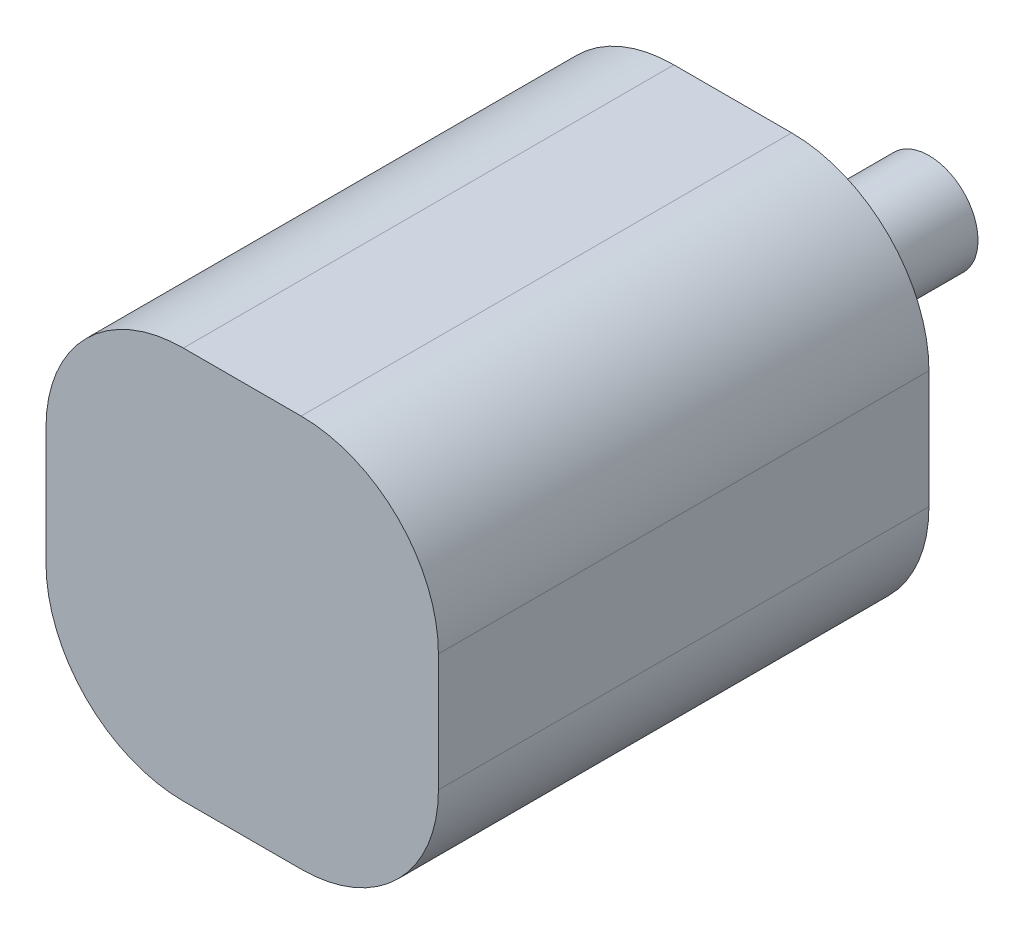
ISO-10303-21;
HEADER;
FILE_DESCRIPTION(('STEP AP214'),'2;1');
FILE_NAME('part.step','',(''),(''),'','','');
FILE_SCHEMA(('AUTOMOTIVE_DESIGN { 1 0 10303 214 1 1 1 1 }'));
ENDSEC;
DATA;
#1=APPLICATION_CONTEXT('core data for automotive mechanical design processes');
#2=APPLICATION_PROTOCOL_DEFINITION('international standard','automotive_design',2000,#1);
#3=PRODUCT_CONTEXT('',#1,'mechanical');
#4=PRODUCT('Part','Part','',(#3));
#5=PRODUCT_RELATED_PRODUCT_CATEGORY('part','',(#4));
#6=PRODUCT_DEFINITION_FORMATION('','',#4);
#7=PRODUCT_DEFINITION_CONTEXT('part definition',#1,'design');
#8=PRODUCT_DEFINITION('design','',#6,#7);
#9=PRODUCT_DEFINITION_SHAPE('','',#8);
#10=(LENGTH_UNIT() NAMED_UNIT(*) SI_UNIT(.MILLI.,.METRE.));
#11=(NAMED_UNIT(*) PLANE_ANGLE_UNIT() SI_UNIT($,.RADIAN.));
#12=(NAMED_UNIT(*) SI_UNIT($,.STERADIAN.) SOLID_ANGLE_UNIT());
#13=UNCERTAINTY_MEASURE_WITH_UNIT(LENGTH_MEASURE(1.E-05),#10,'distance_accuracy_value','');
#14=(GEOMETRIC_REPRESENTATION_CONTEXT(3) GLOBAL_UNCERTAINTY_ASSIGNED_CONTEXT((#13)) GLOBAL_UNIT_ASSIGNED_CONTEXT((#10,
#11,#12)) REPRESENTATION_CONTEXT('',''));
#15=CARTESIAN_POINT('',(0.,0.,0.));
#16=DIRECTION('',(0.,0.,1.));
#17=DIRECTION('',(1.,0.,0.));
#18=AXIS2_PLACEMENT_3D('',#15,#16,#17);
#19=CARTESIAN_POINT('',(0.,0.,10.));
#20=DIRECTION('',(0.,0.,-1.));
#21=DIRECTION('',(-1.,0.,0.));
#22=AXIS2_PLACEMENT_3D('',#19,#20,#21);
#23=CYLINDRICAL_SURFACE('',#22,2.5);
#24=CARTESIAN_POINT('',(0.,0.,10.));
#25=DIRECTION('',(0.,0.,1.));
#26=DIRECTION('',(1.,0.,0.));
#27=AXIS2_PLACEMENT_3D('',#24,#25,#26);
#28=CIRCLE('',#27,2.5);
#29=CARTESIAN_POINT('',(2.5,0.,10.));
#30=VERTEX_POINT('',#29);
#31=EDGE_CURVE('E140',#30,#30,#28,.T.);
#32=ORIENTED_EDGE('',*,*,#31,.F.);
#33=EDGE_LOOP('',(#32));
#34=FACE_BOUND('',#33,.T.);
#35=CARTESIAN_POINT('',(0.,0.,0.));
#36=DIRECTION('',(0.,0.,1.));
#37=DIRECTION('',(1.,0.,0.));
#38=AXIS2_PLACEMENT_3D('',#35,#36,#37);
#39=CIRCLE('',#38,2.5);
#40=CARTESIAN_POINT('',(2.5,0.,0.));
#41=VERTEX_POINT('',#40);
#42=EDGE_CURVE('E143',#41,#41,#39,.T.);
#43=ORIENTED_EDGE('',*,*,#42,.T.);
#44=EDGE_LOOP('',(#43));
#45=FACE_BOUND('',#44,.T.);
#46=ADVANCED_FACE('F37',(#34,#45),#23,.T.);
#47=CARTESIAN_POINT('',(0.,0.,0.));
#48=DIRECTION('',(0.,0.,1.));
#49=DIRECTION('',(1.,0.,0.));
#50=AXIS2_PLACEMENT_3D('',#47,#48,#49);
#51=PLANE('',#50);
#52=ORIENTED_EDGE('',*,*,#42,.F.);
#53=EDGE_LOOP('',(#52));
#54=FACE_BOUND('',#53,.T.);
#55=ADVANCED_FACE('F198',(#54),#51,.F.);
#56=CARTESIAN_POINT('',(10.,10.,35.));
#57=DIRECTION('',(-1.,0.,0.));
#58=DIRECTION('',(0.,-1.,0.));
#59=AXIS2_PLACEMENT_3D('',#56,#57,#58);
#60=PLANE('',#59);
#61=DIRECTION('',(0.,1.,0.));
#62=VECTOR('',#61,1.);
#63=CARTESIAN_POINT('',(10.,10.,35.));
#64=LINE('',#63,#62);
#65=CARTESIAN_POINT('',(10.,-3.,35.));
#66=VERTEX_POINT('',#65);
#67=CARTESIAN_POINT('',(10.,3.,35.));
#68=VERTEX_POINT('',#67);
#69=EDGE_CURVE('E131',#66,#68,#64,.T.);
#70=ORIENTED_EDGE('',*,*,#69,.F.);
#71=DIRECTION('',(0.,0.,-1.));
#72=VECTOR('',#71,1.);
#73=CARTESIAN_POINT('',(10.,-3.,35.));
#74=LINE('',#73,#72);
#75=CARTESIAN_POINT('',(10.,-3.,10.));
#76=VERTEX_POINT('',#75);
#77=EDGE_CURVE('E11',#66,#76,#74,.T.);
#78=ORIENTED_EDGE('',*,*,#77,.T.);
#79=DIRECTION('',(0.,1.,0.));
#80=VECTOR('',#79,1.);
#81=CARTESIAN_POINT('',(10.,10.,10.));
#82=LINE('',#81,#80);
#83=CARTESIAN_POINT('',(10.,3.,10.));
#84=VERTEX_POINT('',#83);
#85=EDGE_CURVE('E169',#76,#84,#82,.T.);
#86=ORIENTED_EDGE('',*,*,#85,.T.);
#87=DIRECTION('',(0.,0.,-1.));
#88=VECTOR('',#87,1.);
#89=CARTESIAN_POINT('',(10.,3.,35.));
#90=LINE('',#89,#88);
#91=EDGE_CURVE('E45',#84,#68,#90,.F.);
#92=ORIENTED_EDGE('',*,*,#91,.T.);
#93=EDGE_LOOP('',(#70,#78,#86,#92));
#94=FACE_BOUND('',#93,.T.);
#95=ADVANCED_FACE('F167',(#94),#60,.F.);
#96=CARTESIAN_POINT('',(-10.,10.,35.));
#97=DIRECTION('',(0.,-1.,0.));
#98=DIRECTION('',(0.,0.,-1.));
#99=AXIS2_PLACEMENT_3D('',#96,#97,#98);
#100=PLANE('',#99);
#101=DIRECTION('',(-1.,0.,0.));
#102=VECTOR('',#101,1.);
#103=CARTESIAN_POINT('',(-10.,10.,10.));
#104=LINE('',#103,#102);
#105=CARTESIAN_POINT('',(3.,10.,10.));
#106=VERTEX_POINT('',#105);
#107=CARTESIAN_POINT('',(-3.,10.,10.));
#108=VERTEX_POINT('',#107);
#109=EDGE_CURVE('E136',#106,#108,#104,.T.);
#110=ORIENTED_EDGE('',*,*,#109,.T.);
#111=DIRECTION('',(0.,0.,-1.));
#112=VECTOR('',#111,1.);
#113=CARTESIAN_POINT('',(-3.,10.,35.));
#114=LINE('',#113,#112);
#115=CARTESIAN_POINT('',(-3.,10.,35.));
#116=VERTEX_POINT('',#115);
#117=EDGE_CURVE('E52',#108,#116,#114,.F.);
#118=ORIENTED_EDGE('',*,*,#117,.T.);
#119=DIRECTION('',(-1.,0.,0.));
#120=VECTOR('',#119,1.);
#121=CARTESIAN_POINT('',(-10.,10.,35.));
#122=LINE('',#121,#120);
#123=CARTESIAN_POINT('',(3.,10.,35.));
#124=VERTEX_POINT('',#123);
#125=EDGE_CURVE('E134',#124,#116,#122,.T.);
#126=ORIENTED_EDGE('',*,*,#125,.F.);
#127=DIRECTION('',(0.,0.,-1.));
#128=VECTOR('',#127,1.);
#129=CARTESIAN_POINT('',(3.,10.,35.));
#130=LINE('',#129,#128);
#131=EDGE_CURVE('E160',#124,#106,#130,.T.);
#132=ORIENTED_EDGE('',*,*,#131,.T.);
#133=EDGE_LOOP('',(#110,#118,#126,#132));
#134=FACE_BOUND('',#133,.T.);
#135=ADVANCED_FACE('F176',(#134),#100,.F.);
#136=CARTESIAN_POINT('',(-10.,10.,35.));
#137=DIRECTION('',(1.,0.,0.));
#138=DIRECTION('',(0.,1.,0.));
#139=AXIS2_PLACEMENT_3D('',#136,#137,#138);
#140=PLANE('',#139);
#141=DIRECTION('',(0.,-1.,0.));
#142=VECTOR('',#141,1.);
#143=CARTESIAN_POINT('',(-10.,10.,10.));
#144=LINE('',#143,#142);
#145=CARTESIAN_POINT('',(-10.,3.,10.));
#146=VERTEX_POINT('',#145);
#147=CARTESIAN_POINT('',(-10.,-3.,10.));
#148=VERTEX_POINT('',#147);
#149=EDGE_CURVE('E132',#146,#148,#144,.T.);
#150=ORIENTED_EDGE('',*,*,#149,.T.);
#151=DIRECTION('',(0.,0.,-1.));
#152=VECTOR('',#151,1.);
#153=CARTESIAN_POINT('',(-10.,-3.,35.));
#154=LINE('',#153,#152);
#155=CARTESIAN_POINT('',(-10.,-3.,35.));
#156=VERTEX_POINT('',#155);
#157=EDGE_CURVE('E109',#148,#156,#154,.F.);
#158=ORIENTED_EDGE('',*,*,#157,.T.);
#159=DIRECTION('',(0.,-1.,0.));
#160=VECTOR('',#159,1.);
#161=CARTESIAN_POINT('',(-10.,10.,35.));
#162=LINE('',#161,#160);
#163=CARTESIAN_POINT('',(-10.,3.,35.));
#164=VERTEX_POINT('',#163);
#165=EDGE_CURVE('E180',#164,#156,#162,.T.);
#166=ORIENTED_EDGE('',*,*,#165,.F.);
#167=DIRECTION('',(0.,0.,-1.));
#168=VECTOR('',#167,1.);
#169=CARTESIAN_POINT('',(-10.,3.,35.));
#170=LINE('',#169,#168);
#171=EDGE_CURVE('E114',#164,#146,#170,.T.);
#172=ORIENTED_EDGE('',*,*,#171,.T.);
#173=EDGE_LOOP('',(#150,#158,#166,#172));
#174=FACE_BOUND('',#173,.T.);
#175=ADVANCED_FACE('F188',(#174),#140,.F.);
#176=CARTESIAN_POINT('',(-10.,-10.,35.));
#177=DIRECTION('',(0.,1.,0.));
#178=DIRECTION('',(0.,0.,1.));
#179=AXIS2_PLACEMENT_3D('',#176,#177,#178);
#180=PLANE('',#179);
#181=DIRECTION('',(1.,0.,0.));
#182=VECTOR('',#181,1.);
#183=CARTESIAN_POINT('',(-10.,-10.,35.));
#184=LINE('',#183,#182);
#185=CARTESIAN_POINT('',(-3.,-10.,35.));
#186=VERTEX_POINT('',#185);
#187=CARTESIAN_POINT('',(3.,-10.,35.));
#188=VERTEX_POINT('',#187);
#189=EDGE_CURVE('E124',#186,#188,#184,.T.);
#190=ORIENTED_EDGE('',*,*,#189,.F.);
#191=DIRECTION('',(0.,0.,-1.));
#192=VECTOR('',#191,1.);
#193=CARTESIAN_POINT('',(-3.,-10.,35.));
#194=LINE('',#193,#192);
#195=CARTESIAN_POINT('',(-3.,-10.,10.));
#196=VERTEX_POINT('',#195);
#197=EDGE_CURVE('E108',#186,#196,#194,.T.);
#198=ORIENTED_EDGE('',*,*,#197,.T.);
#199=DIRECTION('',(1.,0.,0.));
#200=VECTOR('',#199,1.);
#201=CARTESIAN_POINT('',(-10.,-10.,10.));
#202=LINE('',#201,#200);
#203=CARTESIAN_POINT('',(3.,-10.,10.));
#204=VERTEX_POINT('',#203);
#205=EDGE_CURVE('E121',#196,#204,#202,.T.);
#206=ORIENTED_EDGE('',*,*,#205,.T.);
#207=DIRECTION('',(0.,0.,-1.));
#208=VECTOR('',#207,1.);
#209=CARTESIAN_POINT('',(3.,-10.,35.));
#210=LINE('',#209,#208);
#211=EDGE_CURVE('E126',#204,#188,#210,.F.);
#212=ORIENTED_EDGE('',*,*,#211,.T.);
#213=EDGE_LOOP('',(#190,#198,#206,#212));
#214=FACE_BOUND('',#213,.T.);
#215=ADVANCED_FACE('F120',(#214),#180,.F.);
#216=CARTESIAN_POINT('',(0.,0.,35.));
#217=DIRECTION('',(0.,0.,1.));
#218=DIRECTION('',(1.,0.,0.));
#219=AXIS2_PLACEMENT_3D('',#216,#217,#218);
#220=PLANE('',#219);
#221=ORIENTED_EDGE('',*,*,#165,.T.);
#222=CARTESIAN_POINT('',(-3.,-3.,35.));
#223=DIRECTION('',(0.,0.,1.));
#224=DIRECTION('',(1.,0.,0.));
#225=AXIS2_PLACEMENT_3D('',#222,#223,#224);
#226=CIRCLE('',#225,7.);
#227=EDGE_CURVE('E158',#156,#186,#226,.T.);
#228=ORIENTED_EDGE('',*,*,#227,.T.);
#229=ORIENTED_EDGE('',*,*,#189,.T.);
#230=CARTESIAN_POINT('',(3.,-3.,35.));
#231=DIRECTION('',(0.,0.,1.));
#232=DIRECTION('',(1.,0.,0.));
#233=AXIS2_PLACEMENT_3D('',#230,#231,#232);
#234=CIRCLE('',#233,7.);
#235=EDGE_CURVE('E154',#188,#66,#234,.T.);
#236=ORIENTED_EDGE('',*,*,#235,.T.);
#237=ORIENTED_EDGE('',*,*,#69,.T.);
#238=CARTESIAN_POINT('',(3.,3.,35.));
#239=DIRECTION('',(0.,0.,1.));
#240=DIRECTION('',(1.,0.,0.));
#241=AXIS2_PLACEMENT_3D('',#238,#239,#240);
#242=CIRCLE('',#241,7.);
#243=EDGE_CURVE('E59',#68,#124,#242,.T.);
#244=ORIENTED_EDGE('',*,*,#243,.T.);
#245=ORIENTED_EDGE('',*,*,#125,.T.);
#246=CARTESIAN_POINT('',(-3.,3.,35.));
#247=DIRECTION('',(0.,0.,1.));
#248=DIRECTION('',(1.,0.,0.));
#249=AXIS2_PLACEMENT_3D('',#246,#247,#248);
#250=CIRCLE('',#249,7.);
#251=EDGE_CURVE('E156',#116,#164,#250,.T.);
#252=ORIENTED_EDGE('',*,*,#251,.T.);
#253=EDGE_LOOP('',(#221,#228,#229,#236,#237,#244,#245,#252));
#254=FACE_BOUND('',#253,.T.);
#255=ADVANCED_FACE('F172',(#254),#220,.T.);
#256=CARTESIAN_POINT('',(0.,0.,10.));
#257=DIRECTION('',(0.,0.,1.));
#258=DIRECTION('',(1.,0.,0.));
#259=AXIS2_PLACEMENT_3D('',#256,#257,#258);
#260=PLANE('',#259);
#261=ORIENTED_EDGE('',*,*,#31,.T.);
#262=EDGE_LOOP('',(#261));
#263=FACE_BOUND('',#262,.T.);
#264=ORIENTED_EDGE('',*,*,#205,.F.);
#265=CARTESIAN_POINT('',(-3.,-3.,10.));
#266=DIRECTION('',(0.,0.,1.));
#267=DIRECTION('',(1.,0.,0.));
#268=AXIS2_PLACEMENT_3D('',#265,#266,#267);
#269=CIRCLE('',#268,7.);
#270=EDGE_CURVE('E104',#196,#148,#269,.F.);
#271=ORIENTED_EDGE('',*,*,#270,.T.);
#272=ORIENTED_EDGE('',*,*,#149,.F.);
#273=CARTESIAN_POINT('',(-3.,3.,10.));
#274=DIRECTION('',(0.,0.,1.));
#275=DIRECTION('',(1.,0.,0.));
#276=AXIS2_PLACEMENT_3D('',#273,#274,#275);
#277=CIRCLE('',#276,7.);
#278=EDGE_CURVE('E115',#146,#108,#277,.F.);
#279=ORIENTED_EDGE('',*,*,#278,.T.);
#280=ORIENTED_EDGE('',*,*,#109,.F.);
#281=CARTESIAN_POINT('',(3.,3.,10.));
#282=DIRECTION('',(0.,0.,1.));
#283=DIRECTION('',(1.,0.,0.));
#284=AXIS2_PLACEMENT_3D('',#281,#282,#283);
#285=CIRCLE('',#284,7.);
#286=EDGE_CURVE('E125',#106,#84,#285,.F.);
#287=ORIENTED_EDGE('',*,*,#286,.T.);
#288=ORIENTED_EDGE('',*,*,#85,.F.);
#289=CARTESIAN_POINT('',(3.,-3.,10.));
#290=DIRECTION('',(0.,0.,1.));
#291=DIRECTION('',(1.,0.,0.));
#292=AXIS2_PLACEMENT_3D('',#289,#290,#291);
#293=CIRCLE('',#292,7.);
#294=EDGE_CURVE('E130',#76,#204,#293,.F.);
#295=ORIENTED_EDGE('',*,*,#294,.T.);
#296=EDGE_LOOP('',(#264,#271,#272,#279,#280,#287,#288,#295));
#297=FACE_BOUND('',#296,.T.);
#298=ADVANCED_FACE('F128',(#263,#297),#260,.F.);
#299=CARTESIAN_POINT('',(-3.,-3.,35.));
#300=DIRECTION('',(0.,0.,-1.));
#301=DIRECTION('',(-1.,0.,0.));
#302=AXIS2_PLACEMENT_3D('',#299,#300,#301);
#303=CYLINDRICAL_SURFACE('',#302,7.);
#304=ORIENTED_EDGE('',*,*,#227,.F.);
#305=ORIENTED_EDGE('',*,*,#157,.F.);
#306=ORIENTED_EDGE('',*,*,#270,.F.);
#307=ORIENTED_EDGE('',*,*,#197,.F.);
#308=EDGE_LOOP('',(#304,#305,#306,#307));
#309=FACE_BOUND('',#308,.T.);
#310=ADVANCED_FACE('F107',(#309),#303,.T.);
#311=CARTESIAN_POINT('',(-3.,3.,35.));
#312=DIRECTION('',(0.,0.,-1.));
#313=DIRECTION('',(-1.,0.,0.));
#314=AXIS2_PLACEMENT_3D('',#311,#312,#313);
#315=CYLINDRICAL_SURFACE('',#314,7.);
#316=ORIENTED_EDGE('',*,*,#251,.F.);
#317=ORIENTED_EDGE('',*,*,#117,.F.);
#318=ORIENTED_EDGE('',*,*,#278,.F.);
#319=ORIENTED_EDGE('',*,*,#171,.F.);
#320=EDGE_LOOP('',(#316,#317,#318,#319));
#321=FACE_BOUND('',#320,.T.);
#322=ADVANCED_FACE('F186',(#321),#315,.T.);
#323=CARTESIAN_POINT('',(3.,-3.,35.));
#324=DIRECTION('',(0.,0.,-1.));
#325=DIRECTION('',(-1.,0.,0.));
#326=AXIS2_PLACEMENT_3D('',#323,#324,#325);
#327=CYLINDRICAL_SURFACE('',#326,7.);
#328=ORIENTED_EDGE('',*,*,#235,.F.);
#329=ORIENTED_EDGE('',*,*,#211,.F.);
#330=ORIENTED_EDGE('',*,*,#294,.F.);
#331=ORIENTED_EDGE('',*,*,#77,.F.);
#332=EDGE_LOOP('',(#328,#329,#330,#331));
#333=FACE_BOUND('',#332,.T.);
#334=ADVANCED_FACE('F190',(#333),#327,.T.);
#335=CARTESIAN_POINT('',(3.,3.,35.));
#336=DIRECTION('',(0.,0.,-1.));
#337=DIRECTION('',(-1.,0.,0.));
#338=AXIS2_PLACEMENT_3D('',#335,#336,#337);
#339=CYLINDRICAL_SURFACE('',#338,7.);
#340=ORIENTED_EDGE('',*,*,#243,.F.);
#341=ORIENTED_EDGE('',*,*,#91,.F.);
#342=ORIENTED_EDGE('',*,*,#286,.F.);
#343=ORIENTED_EDGE('',*,*,#131,.F.);
#344=EDGE_LOOP('',(#340,#341,#342,#343));
#345=FACE_BOUND('',#344,.T.);
#346=ADVANCED_FACE('F39',(#345),#339,.T.);
#347=CLOSED_SHELL('',(#46,#55,#95,#135,#175,#215,#255,#298,#310,#322,#334,#346));
#348=MANIFOLD_SOLID_BREP('B2',#347);
#349=ADVANCED_BREP_SHAPE_REPRESENTATION('',(#18,#348),#14);
#350=SHAPE_DEFINITION_REPRESENTATION(#9,#349);
ENDSEC;
END-ISO-10303-21;
